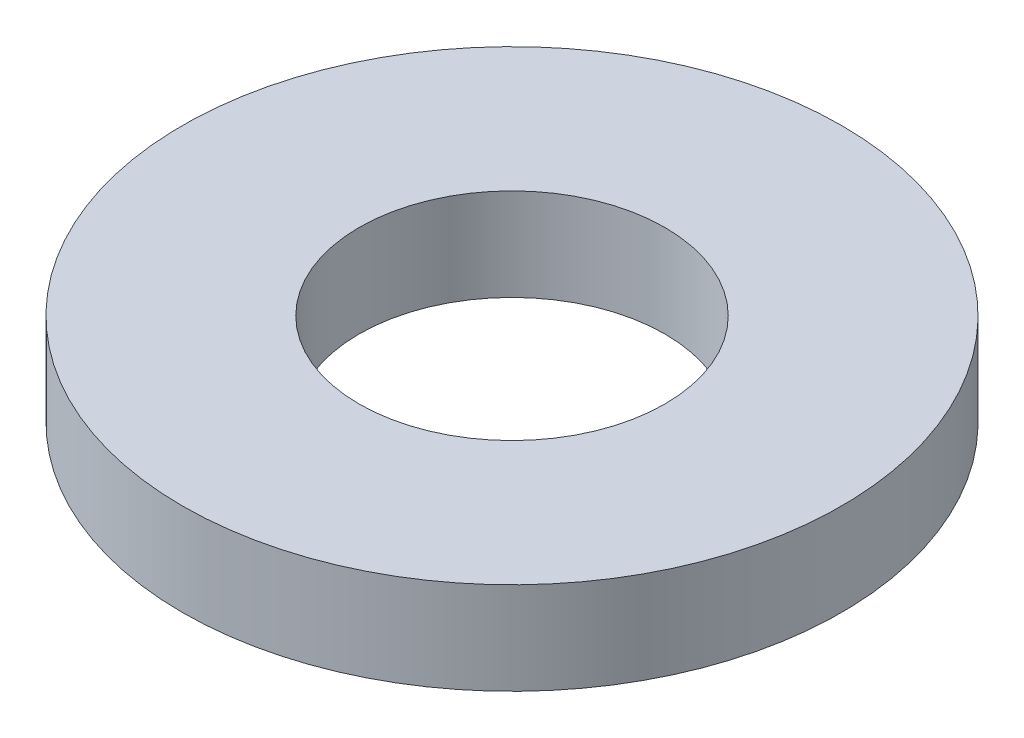
ISO-10303-21;
HEADER;
FILE_DESCRIPTION(('STEP AP214'),'2;1');
FILE_NAME('part.step','',(''),(''),'','','');
FILE_SCHEMA(('AUTOMOTIVE_DESIGN { 1 0 10303 214 1 1 1 1 }'));
ENDSEC;
DATA;
#1=APPLICATION_CONTEXT('core data for automotive mechanical design processes');
#2=APPLICATION_PROTOCOL_DEFINITION('international standard','automotive_design',2000,#1);
#3=PRODUCT_CONTEXT('',#1,'mechanical');
#4=PRODUCT('Part','Part','',(#3));
#5=PRODUCT_RELATED_PRODUCT_CATEGORY('part','',(#4));
#6=PRODUCT_DEFINITION_FORMATION('','',#4);
#7=PRODUCT_DEFINITION_CONTEXT('part definition',#1,'design');
#8=PRODUCT_DEFINITION('design','',#6,#7);
#9=PRODUCT_DEFINITION_SHAPE('','',#8);
#10=(LENGTH_UNIT() NAMED_UNIT(*) SI_UNIT(.MILLI.,.METRE.));
#11=(NAMED_UNIT(*) PLANE_ANGLE_UNIT() SI_UNIT($,.RADIAN.));
#12=(NAMED_UNIT(*) SI_UNIT($,.STERADIAN.) SOLID_ANGLE_UNIT());
#13=UNCERTAINTY_MEASURE_WITH_UNIT(LENGTH_MEASURE(1.E-05),#10,'distance_accuracy_value','');
#14=(GEOMETRIC_REPRESENTATION_CONTEXT(3) GLOBAL_UNCERTAINTY_ASSIGNED_CONTEXT((#13)) GLOBAL_UNIT_ASSIGNED_CONTEXT((#10,
#11,#12)) REPRESENTATION_CONTEXT('',''));
#15=CARTESIAN_POINT('',(0.,0.,0.));
#16=DIRECTION('',(0.,0.,1.));
#17=DIRECTION('',(1.,0.,0.));
#18=AXIS2_PLACEMENT_3D('',#15,#16,#17);
#19=CARTESIAN_POINT('',(0.,0.889,0.));
#20=DIRECTION('',(0.,1.,0.));
#21=DIRECTION('',(0.,0.,1.));
#22=AXIS2_PLACEMENT_3D('',#19,#20,#21);
#23=PLANE('',#22);
#24=CARTESIAN_POINT('',(0.,0.889,0.));
#25=DIRECTION('',(0.,1.,0.));
#26=DIRECTION('',(0.,0.,1.));
#27=AXIS2_PLACEMENT_3D('',#24,#25,#26);
#28=CIRCLE('',#27,1.4732);
#29=CARTESIAN_POINT('',(0.,0.889,1.4732));
#30=VERTEX_POINT('',#29);
#31=EDGE_CURVE('E26',#30,#30,#28,.F.);
#32=ORIENTED_EDGE('',*,*,#31,.T.);
#33=EDGE_LOOP('',(#32));
#34=FACE_BOUND('',#33,.T.);
#35=CARTESIAN_POINT('',(0.,0.889,0.));
#36=DIRECTION('',(0.,-1.,0.));
#37=DIRECTION('',(0.,0.,-1.));
#38=AXIS2_PLACEMENT_3D('',#35,#36,#37);
#39=CIRCLE('',#38,3.175);
#40=CARTESIAN_POINT('',(0.,0.889,-3.175));
#41=VERTEX_POINT('',#40);
#42=EDGE_CURVE('E17',#41,#41,#39,.T.);
#43=ORIENTED_EDGE('',*,*,#42,.F.);
#44=EDGE_LOOP('',(#43));
#45=FACE_BOUND('',#44,.T.);
#46=ADVANCED_FACE('F14',(#34,#45),#23,.T.);
#47=CARTESIAN_POINT('',(0.,0.889,0.));
#48=DIRECTION('',(0.,-1.,0.));
#49=DIRECTION('',(0.,0.,-1.));
#50=AXIS2_PLACEMENT_3D('',#47,#48,#49);
#51=CYLINDRICAL_SURFACE('',#50,3.175);
#52=CARTESIAN_POINT('',(0.,0.,0.));
#53=DIRECTION('',(0.,-1.,0.));
#54=DIRECTION('',(0.,0.,-1.));
#55=AXIS2_PLACEMENT_3D('',#52,#53,#54);
#56=CIRCLE('',#55,3.175);
#57=CARTESIAN_POINT('',(0.,0.,-3.175));
#58=VERTEX_POINT('',#57);
#59=EDGE_CURVE('E21',#58,#58,#56,.F.);
#60=ORIENTED_EDGE('',*,*,#59,.T.);
#61=EDGE_LOOP('',(#60));
#62=FACE_BOUND('',#61,.T.);
#63=ORIENTED_EDGE('',*,*,#42,.T.);
#64=EDGE_LOOP('',(#63));
#65=FACE_BOUND('',#64,.T.);
#66=ADVANCED_FACE('F34',(#62,#65),#51,.T.);
#67=CARTESIAN_POINT('',(0.,0.,0.));
#68=DIRECTION('',(0.,1.,0.));
#69=DIRECTION('',(0.,0.,1.));
#70=AXIS2_PLACEMENT_3D('',#67,#68,#69);
#71=CYLINDRICAL_SURFACE('',#70,1.4732);
#72=ORIENTED_EDGE('',*,*,#31,.F.);
#73=EDGE_LOOP('',(#72));
#74=FACE_BOUND('',#73,.T.);
#75=CARTESIAN_POINT('',(0.,0.,0.));
#76=DIRECTION('',(0.,1.,0.));
#77=DIRECTION('',(0.,0.,1.));
#78=AXIS2_PLACEMENT_3D('',#75,#76,#77);
#79=CIRCLE('',#78,1.4732);
#80=CARTESIAN_POINT('',(0.,0.,1.4732));
#81=VERTEX_POINT('',#80);
#82=EDGE_CURVE('E10',#81,#81,#79,.F.);
#83=ORIENTED_EDGE('',*,*,#82,.T.);
#84=EDGE_LOOP('',(#83));
#85=FACE_BOUND('',#84,.T.);
#86=ADVANCED_FACE('F41',(#74,#85),#71,.F.);
#87=CARTESIAN_POINT('',(0.,0.,0.));
#88=DIRECTION('',(0.,1.,0.));
#89=DIRECTION('',(0.,0.,1.));
#90=AXIS2_PLACEMENT_3D('',#87,#88,#89);
#91=PLANE('',#90);
#92=ORIENTED_EDGE('',*,*,#82,.F.);
#93=EDGE_LOOP('',(#92));
#94=FACE_BOUND('',#93,.T.);
#95=ORIENTED_EDGE('',*,*,#59,.F.);
#96=EDGE_LOOP('',(#95));
#97=FACE_BOUND('',#96,.T.);
#98=ADVANCED_FACE('F43',(#94,#97),#91,.F.);
#99=CLOSED_SHELL('',(#46,#66,#86,#98));
#100=MANIFOLD_SOLID_BREP('B1',#99);
#101=ADVANCED_BREP_SHAPE_REPRESENTATION('',(#18,#100),#14);
#102=SHAPE_DEFINITION_REPRESENTATION(#9,#101);
ENDSEC;
END-ISO-10303-21;
